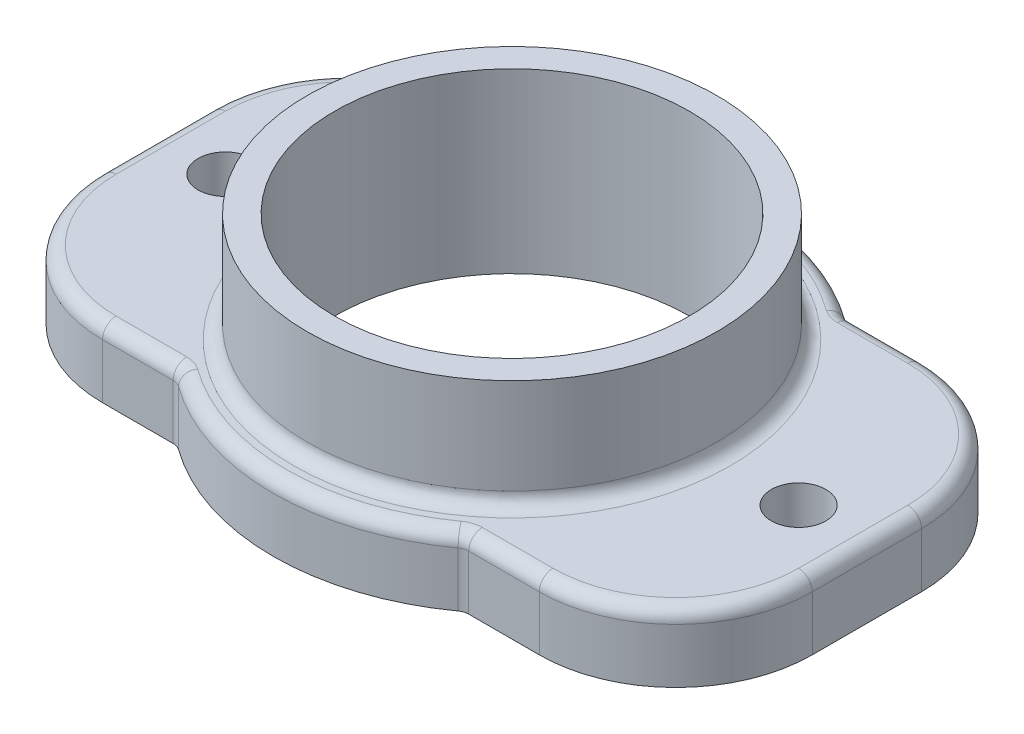
ISO-10303-21;
HEADER;
FILE_DESCRIPTION(('STEP AP214'),'2;1');
FILE_NAME('part.step','',(''),(''),'','','');
FILE_SCHEMA(('AUTOMOTIVE_DESIGN { 1 0 10303 214 1 1 1 1 }'));
ENDSEC;
DATA;
#1=APPLICATION_CONTEXT('core data for automotive mechanical design processes');
#2=APPLICATION_PROTOCOL_DEFINITION('international standard','automotive_design',2000,#1);
#3=PRODUCT_CONTEXT('',#1,'mechanical');
#4=PRODUCT('Part','Part','',(#3));
#5=PRODUCT_RELATED_PRODUCT_CATEGORY('part','',(#4));
#6=PRODUCT_DEFINITION_FORMATION('','',#4);
#7=PRODUCT_DEFINITION_CONTEXT('part definition',#1,'design');
#8=PRODUCT_DEFINITION('design','',#6,#7);
#9=PRODUCT_DEFINITION_SHAPE('','',#8);
#10=(LENGTH_UNIT() NAMED_UNIT(*) SI_UNIT(.MILLI.,.METRE.));
#11=(NAMED_UNIT(*) PLANE_ANGLE_UNIT() SI_UNIT($,.RADIAN.));
#12=(NAMED_UNIT(*) SI_UNIT($,.STERADIAN.) SOLID_ANGLE_UNIT());
#13=UNCERTAINTY_MEASURE_WITH_UNIT(LENGTH_MEASURE(1.E-05),#10,'distance_accuracy_value','');
#14=(GEOMETRIC_REPRESENTATION_CONTEXT(3) GLOBAL_UNCERTAINTY_ASSIGNED_CONTEXT((#13)) GLOBAL_UNIT_ASSIGNED_CONTEXT((#10,
#11,#12)) REPRESENTATION_CONTEXT('',''));
#15=CARTESIAN_POINT('',(0.,0.,0.));
#16=DIRECTION('',(0.,0.,1.));
#17=DIRECTION('',(1.,0.,0.));
#18=AXIS2_PLACEMENT_3D('',#15,#16,#17);
#19=CARTESIAN_POINT('',(0.,5.,0.));
#20=DIRECTION('',(0.,1.,0.));
#21=DIRECTION('',(0.,0.,1.));
#22=AXIS2_PLACEMENT_3D('',#19,#20,#21);
#23=PLANE('',#22);
#24=CARTESIAN_POINT('',(0.,5.,0.));
#25=DIRECTION('',(0.,1.,0.));
#26=DIRECTION('',(0.,0.,1.));
#27=AXIS2_PLACEMENT_3D('',#24,#25,#26);
#28=CIRCLE('',#27,16.5);
#29=CARTESIAN_POINT('',(9.65758727451832,5.,-13.3783783783784));
#30=VERTEX_POINT('',#29);
#31=CARTESIAN_POINT('',(-9.65758727451832,5.,-13.3783783783784));
#32=VERTEX_POINT('',#31);
#33=EDGE_CURVE('E312',#30,#32,#28,.T.);
#34=ORIENTED_EDGE('',*,*,#33,.T.);
#35=CARTESIAN_POINT('',(-10.8282039138539,5.,-15.));
#36=DIRECTION('',(0.,1.,0.));
#37=DIRECTION('',(0.,0.,1.));
#38=AXIS2_PLACEMENT_3D('',#35,#36,#37);
#39=CIRCLE('',#38,2.);
#40=CARTESIAN_POINT('',(-10.8282039138539,5.,-13.));
#41=VERTEX_POINT('',#40);
#42=EDGE_CURVE('E314',#32,#41,#39,.F.);
#43=ORIENTED_EDGE('',*,*,#42,.T.);
#44=DIRECTION('',(-1.,0.,0.));
#45=VECTOR('',#44,1.);
#46=CARTESIAN_POINT('',(-16.,5.,-13.));
#47=LINE('',#46,#45);
#48=CARTESIAN_POINT('',(-16.,5.,-13.));
#49=VERTEX_POINT('',#48);
#50=EDGE_CURVE('E284',#41,#49,#47,.T.);
#51=ORIENTED_EDGE('',*,*,#50,.T.);
#52=CARTESIAN_POINT('',(-16.,5.,-4.));
#53=DIRECTION('',(0.,1.,0.));
#54=DIRECTION('',(0.,0.,1.));
#55=AXIS2_PLACEMENT_3D('',#52,#53,#54);
#56=CIRCLE('',#55,9.);
#57=CARTESIAN_POINT('',(-25.,5.,-4.));
#58=VERTEX_POINT('',#57);
#59=EDGE_CURVE('E286',#49,#58,#56,.T.);
#60=ORIENTED_EDGE('',*,*,#59,.T.);
#61=DIRECTION('',(0.,0.,1.));
#62=VECTOR('',#61,1.);
#63=CARTESIAN_POINT('',(-25.,5.,4.));
#64=LINE('',#63,#62);
#65=CARTESIAN_POINT('',(-25.,5.,4.));
#66=VERTEX_POINT('',#65);
#67=EDGE_CURVE('E288',#58,#66,#64,.T.);
#68=ORIENTED_EDGE('',*,*,#67,.T.);
#69=CARTESIAN_POINT('',(-16.,5.,4.));
#70=DIRECTION('',(0.,1.,0.));
#71=DIRECTION('',(0.,0.,1.));
#72=AXIS2_PLACEMENT_3D('',#69,#70,#71);
#73=CIRCLE('',#72,9.);
#74=CARTESIAN_POINT('',(-16.,5.,13.));
#75=VERTEX_POINT('',#74);
#76=EDGE_CURVE('E290',#66,#75,#73,.T.);
#77=ORIENTED_EDGE('',*,*,#76,.T.);
#78=DIRECTION('',(1.,0.,0.));
#79=VECTOR('',#78,1.);
#80=CARTESIAN_POINT('',(-10.8282039138539,5.,13.));
#81=LINE('',#80,#79);
#82=CARTESIAN_POINT('',(-10.8282039138539,5.,13.));
#83=VERTEX_POINT('',#82);
#84=EDGE_CURVE('E292',#75,#83,#81,.T.);
#85=ORIENTED_EDGE('',*,*,#84,.T.);
#86=CARTESIAN_POINT('',(-10.8282039138539,5.,15.));
#87=DIRECTION('',(0.,1.,0.));
#88=DIRECTION('',(0.,0.,1.));
#89=AXIS2_PLACEMENT_3D('',#86,#87,#88);
#90=CIRCLE('',#89,2.);
#91=CARTESIAN_POINT('',(-9.65758727451831,5.,13.3783783783784));
#92=VERTEX_POINT('',#91);
#93=EDGE_CURVE('E294',#83,#92,#90,.F.);
#94=ORIENTED_EDGE('',*,*,#93,.T.);
#95=CARTESIAN_POINT('',(0.,5.,0.));
#96=DIRECTION('',(0.,1.,0.));
#97=DIRECTION('',(0.,0.,1.));
#98=AXIS2_PLACEMENT_3D('',#95,#96,#97);
#99=CIRCLE('',#98,16.5);
#100=CARTESIAN_POINT('',(9.65758727451832,5.,13.3783783783784));
#101=VERTEX_POINT('',#100);
#102=EDGE_CURVE('E296',#92,#101,#99,.T.);
#103=ORIENTED_EDGE('',*,*,#102,.T.);
#104=CARTESIAN_POINT('',(10.8282039138539,5.,15.));
#105=DIRECTION('',(0.,1.,0.));
#106=DIRECTION('',(0.,0.,1.));
#107=AXIS2_PLACEMENT_3D('',#104,#105,#106);
#108=CIRCLE('',#107,2.);
#109=CARTESIAN_POINT('',(10.8282039138539,5.,13.));
#110=VERTEX_POINT('',#109);
#111=EDGE_CURVE('E298',#101,#110,#108,.F.);
#112=ORIENTED_EDGE('',*,*,#111,.T.);
#113=DIRECTION('',(1.,0.,0.));
#114=VECTOR('',#113,1.);
#115=CARTESIAN_POINT('',(16.,5.,13.));
#116=LINE('',#115,#114);
#117=CARTESIAN_POINT('',(16.,5.,13.));
#118=VERTEX_POINT('',#117);
#119=EDGE_CURVE('E300',#110,#118,#116,.T.);
#120=ORIENTED_EDGE('',*,*,#119,.T.);
#121=CARTESIAN_POINT('',(16.,5.,4.));
#122=DIRECTION('',(0.,1.,0.));
#123=DIRECTION('',(0.,0.,1.));
#124=AXIS2_PLACEMENT_3D('',#121,#122,#123);
#125=CIRCLE('',#124,9.);
#126=CARTESIAN_POINT('',(25.,5.,4.));
#127=VERTEX_POINT('',#126);
#128=EDGE_CURVE('E302',#118,#127,#125,.T.);
#129=ORIENTED_EDGE('',*,*,#128,.T.);
#130=DIRECTION('',(0.,0.,-1.));
#131=VECTOR('',#130,1.);
#132=CARTESIAN_POINT('',(25.,5.,-4.));
#133=LINE('',#132,#131);
#134=CARTESIAN_POINT('',(25.,5.,-4.));
#135=VERTEX_POINT('',#134);
#136=EDGE_CURVE('E304',#127,#135,#133,.T.);
#137=ORIENTED_EDGE('',*,*,#136,.T.);
#138=CARTESIAN_POINT('',(16.,5.,-4.));
#139=DIRECTION('',(0.,1.,0.));
#140=DIRECTION('',(0.,0.,1.));
#141=AXIS2_PLACEMENT_3D('',#138,#139,#140);
#142=CIRCLE('',#141,9.);
#143=CARTESIAN_POINT('',(16.,5.,-13.));
#144=VERTEX_POINT('',#143);
#145=EDGE_CURVE('E306',#135,#144,#142,.T.);
#146=ORIENTED_EDGE('',*,*,#145,.T.);
#147=DIRECTION('',(-1.,0.,0.));
#148=VECTOR('',#147,1.);
#149=CARTESIAN_POINT('',(10.8282039138539,5.,-13.));
#150=LINE('',#149,#148);
#151=CARTESIAN_POINT('',(10.8282039138539,5.,-13.));
#152=VERTEX_POINT('',#151);
#153=EDGE_CURVE('E308',#144,#152,#150,.T.);
#154=ORIENTED_EDGE('',*,*,#153,.T.);
#155=CARTESIAN_POINT('',(10.8282039138539,5.,-15.));
#156=DIRECTION('',(0.,1.,0.));
#157=DIRECTION('',(0.,0.,1.));
#158=AXIS2_PLACEMENT_3D('',#155,#156,#157);
#159=CIRCLE('',#158,2.);
#160=EDGE_CURVE('E310',#152,#30,#159,.F.);
#161=ORIENTED_EDGE('',*,*,#160,.T.);
#162=EDGE_LOOP('',(#34,#43,#51,#60,#68,#77,#85,#94,#103,#112,#120,#129,#137,#146,#154,#161));
#163=FACE_BOUND('',#162,.T.);
#164=CARTESIAN_POINT('',(0.,5.,0.));
#165=DIRECTION('',(0.,1.,0.));
#166=DIRECTION('',(0.,0.,1.));
#167=AXIS2_PLACEMENT_3D('',#164,#165,#166);
#168=CIRCLE('',#167,16.);
#169=CARTESIAN_POINT('',(0.,5.,16.));
#170=VERTEX_POINT('',#169);
#171=EDGE_CURVE('E255',#170,#170,#168,.F.);
#172=ORIENTED_EDGE('',*,*,#171,.T.);
#173=EDGE_LOOP('',(#172));
#174=FACE_BOUND('',#173,.T.);
#175=CARTESIAN_POINT('',(-21.,5.,0.));
#176=DIRECTION('',(0.,1.,0.));
#177=DIRECTION('',(0.,0.,1.));
#178=AXIS2_PLACEMENT_3D('',#175,#176,#177);
#179=CIRCLE('',#178,2.);
#180=CARTESIAN_POINT('',(-21.,5.,2.));
#181=VERTEX_POINT('',#180);
#182=EDGE_CURVE('E407',#181,#181,#179,.T.);
#183=ORIENTED_EDGE('',*,*,#182,.F.);
#184=EDGE_LOOP('',(#183));
#185=FACE_BOUND('',#184,.T.);
#186=CARTESIAN_POINT('',(21.,5.,0.));
#187=DIRECTION('',(0.,1.,0.));
#188=DIRECTION('',(0.,0.,1.));
#189=AXIS2_PLACEMENT_3D('',#186,#187,#188);
#190=CIRCLE('',#189,2.);
#191=CARTESIAN_POINT('',(21.,5.,2.));
#192=VERTEX_POINT('',#191);
#193=EDGE_CURVE('E397',#192,#192,#190,.F.);
#194=ORIENTED_EDGE('',*,*,#193,.T.);
#195=EDGE_LOOP('',(#194));
#196=FACE_BOUND('',#195,.T.);
#197=ADVANCED_FACE('F35',(#163,#174,#185,#196),#23,.T.);
#198=CARTESIAN_POINT('',(0.,0.,0.));
#199=DIRECTION('',(0.,1.,0.));
#200=DIRECTION('',(0.,0.,1.));
#201=AXIS2_PLACEMENT_3D('',#198,#199,#200);
#202=PLANE('',#201);
#203=DIRECTION('',(-1.,0.,0.));
#204=VECTOR('',#203,1.);
#205=CARTESIAN_POINT('',(-26.,0.,-14.));
#206=LINE('',#205,#204);
#207=CARTESIAN_POINT('',(16.,0.,-14.));
#208=VERTEX_POINT('',#207);
#209=CARTESIAN_POINT('',(10.8282039138539,0.,-14.));
#210=VERTEX_POINT('',#209);
#211=EDGE_CURVE('E203',#208,#210,#206,.T.);
#212=ORIENTED_EDGE('',*,*,#211,.F.);
#213=CARTESIAN_POINT('',(16.,0.,-4.));
#214=DIRECTION('',(0.,1.,0.));
#215=DIRECTION('',(0.,0.,1.));
#216=AXIS2_PLACEMENT_3D('',#213,#214,#215);
#217=CIRCLE('',#216,10.);
#218=CARTESIAN_POINT('',(26.,0.,-4.));
#219=VERTEX_POINT('',#218);
#220=EDGE_CURVE('E212',#208,#219,#217,.F.);
#221=ORIENTED_EDGE('',*,*,#220,.T.);
#222=DIRECTION('',(0.,0.,-1.));
#223=VECTOR('',#222,1.);
#224=CARTESIAN_POINT('',(26.,0.,-14.));
#225=LINE('',#224,#223);
#226=CARTESIAN_POINT('',(26.,0.,3.99999999999999));
#227=VERTEX_POINT('',#226);
#228=EDGE_CURVE('E229',#227,#219,#225,.T.);
#229=ORIENTED_EDGE('',*,*,#228,.F.);
#230=CARTESIAN_POINT('',(16.,0.,4.));
#231=DIRECTION('',(0.,1.,0.));
#232=DIRECTION('',(0.,0.,1.));
#233=AXIS2_PLACEMENT_3D('',#230,#231,#232);
#234=CIRCLE('',#233,10.);
#235=CARTESIAN_POINT('',(16.,0.,14.));
#236=VERTEX_POINT('',#235);
#237=EDGE_CURVE('E220',#227,#236,#234,.F.);
#238=ORIENTED_EDGE('',*,*,#237,.T.);
#239=DIRECTION('',(1.,0.,0.));
#240=VECTOR('',#239,1.);
#241=CARTESIAN_POINT('',(-26.,0.,14.));
#242=LINE('',#241,#240);
#243=CARTESIAN_POINT('',(10.8282039138539,0.,14.));
#244=VERTEX_POINT('',#243);
#245=EDGE_CURVE('E425',#244,#236,#242,.T.);
#246=ORIENTED_EDGE('',*,*,#245,.F.);
#247=CARTESIAN_POINT('',(10.8282039138539,0.,15.));
#248=DIRECTION('',(0.,1.,0.));
#249=DIRECTION('',(0.,0.,1.));
#250=AXIS2_PLACEMENT_3D('',#247,#248,#249);
#251=CIRCLE('',#250,1.);
#252=CARTESIAN_POINT('',(10.2428955941861,0.,14.1891891891892));
#253=VERTEX_POINT('',#252);
#254=EDGE_CURVE('E282',#244,#253,#251,.T.);
#255=ORIENTED_EDGE('',*,*,#254,.T.);
#256=CARTESIAN_POINT('',(0.,0.,0.));
#257=DIRECTION('',(0.,1.,0.));
#258=DIRECTION('',(0.,0.,1.));
#259=AXIS2_PLACEMENT_3D('',#256,#257,#258);
#260=CIRCLE('',#259,17.5);
#261=CARTESIAN_POINT('',(-10.2428955941861,0.,14.1891891891892));
#262=VERTEX_POINT('',#261);
#263=EDGE_CURVE('E419',#262,#253,#260,.T.);
#264=ORIENTED_EDGE('',*,*,#263,.F.);
#265=CARTESIAN_POINT('',(-10.8282039138539,0.,15.));
#266=DIRECTION('',(0.,1.,0.));
#267=DIRECTION('',(0.,0.,1.));
#268=AXIS2_PLACEMENT_3D('',#265,#266,#267);
#269=CIRCLE('',#268,1.);
#270=CARTESIAN_POINT('',(-10.8282039138539,0.,14.));
#271=VERTEX_POINT('',#270);
#272=EDGE_CURVE('E280',#262,#271,#269,.T.);
#273=ORIENTED_EDGE('',*,*,#272,.T.);
#274=CARTESIAN_POINT('',(-16.,0.,14.));
#275=VERTEX_POINT('',#274);
#276=EDGE_CURVE('E426',#275,#271,#242,.T.);
#277=ORIENTED_EDGE('',*,*,#276,.F.);
#278=CARTESIAN_POINT('',(-16.,0.,4.));
#279=DIRECTION('',(0.,1.,0.));
#280=DIRECTION('',(0.,0.,1.));
#281=AXIS2_PLACEMENT_3D('',#278,#279,#280);
#282=CIRCLE('',#281,10.);
#283=CARTESIAN_POINT('',(-26.,0.,4.));
#284=VERTEX_POINT('',#283);
#285=EDGE_CURVE('E235',#275,#284,#282,.F.);
#286=ORIENTED_EDGE('',*,*,#285,.T.);
#287=DIRECTION('',(0.,0.,1.));
#288=VECTOR('',#287,1.);
#289=CARTESIAN_POINT('',(-26.,0.,-14.));
#290=LINE('',#289,#288);
#291=CARTESIAN_POINT('',(-26.,0.,-4.));
#292=VERTEX_POINT('',#291);
#293=EDGE_CURVE('E423',#292,#284,#290,.T.);
#294=ORIENTED_EDGE('',*,*,#293,.F.);
#295=CARTESIAN_POINT('',(-16.,0.,-4.));
#296=DIRECTION('',(0.,1.,0.));
#297=DIRECTION('',(0.,0.,1.));
#298=AXIS2_PLACEMENT_3D('',#295,#296,#297);
#299=CIRCLE('',#298,10.);
#300=CARTESIAN_POINT('',(-16.,0.,-14.));
#301=VERTEX_POINT('',#300);
#302=EDGE_CURVE('E209',#292,#301,#299,.F.);
#303=ORIENTED_EDGE('',*,*,#302,.T.);
#304=CARTESIAN_POINT('',(-10.8282039138539,0.,-14.));
#305=VERTEX_POINT('',#304);
#306=EDGE_CURVE('E227',#305,#301,#206,.T.);
#307=ORIENTED_EDGE('',*,*,#306,.F.);
#308=CARTESIAN_POINT('',(-10.8282039138539,0.,-15.));
#309=DIRECTION('',(0.,1.,0.));
#310=DIRECTION('',(0.,0.,1.));
#311=AXIS2_PLACEMENT_3D('',#308,#309,#310);
#312=CIRCLE('',#311,1.);
#313=CARTESIAN_POINT('',(-10.2428955941861,0.,-14.1891891891892));
#314=VERTEX_POINT('',#313);
#315=EDGE_CURVE('E278',#305,#314,#312,.T.);
#316=ORIENTED_EDGE('',*,*,#315,.T.);
#317=CARTESIAN_POINT('',(10.2428955941861,0.,-14.1891891891892));
#318=VERTEX_POINT('',#317);
#319=EDGE_CURVE('E422',#318,#314,#260,.T.);
#320=ORIENTED_EDGE('',*,*,#319,.F.);
#321=CARTESIAN_POINT('',(10.8282039138539,0.,-15.));
#322=DIRECTION('',(0.,1.,0.));
#323=DIRECTION('',(0.,0.,1.));
#324=AXIS2_PLACEMENT_3D('',#321,#322,#323);
#325=CIRCLE('',#324,1.);
#326=EDGE_CURVE('E226',#318,#210,#325,.T.);
#327=ORIENTED_EDGE('',*,*,#326,.T.);
#328=EDGE_LOOP('',(#212,#221,#229,#238,#246,#255,#264,#273,#277,#286,#294,#303,#307,#316,#320,#327));
#329=FACE_BOUND('',#328,.T.);
#330=CARTESIAN_POINT('',(0.,0.,0.));
#331=DIRECTION('',(0.,1.,0.));
#332=DIRECTION('',(0.,0.,1.));
#333=AXIS2_PLACEMENT_3D('',#330,#331,#332);
#334=CIRCLE('',#333,13.);
#335=CARTESIAN_POINT('',(0.,0.,13.));
#336=VERTEX_POINT('',#335);
#337=EDGE_CURVE('E411',#336,#336,#334,.T.);
#338=ORIENTED_EDGE('',*,*,#337,.T.);
#339=EDGE_LOOP('',(#338));
#340=FACE_BOUND('',#339,.T.);
#341=CARTESIAN_POINT('',(-21.,0.,0.));
#342=DIRECTION('',(0.,-1.,0.));
#343=DIRECTION('',(0.,0.,-1.));
#344=AXIS2_PLACEMENT_3D('',#341,#342,#343);
#345=CIRCLE('',#344,2.);
#346=CARTESIAN_POINT('',(-21.,0.,-2.));
#347=VERTEX_POINT('',#346);
#348=EDGE_CURVE('E402',#347,#347,#345,.T.);
#349=ORIENTED_EDGE('',*,*,#348,.F.);
#350=EDGE_LOOP('',(#349));
#351=FACE_BOUND('',#350,.T.);
#352=CARTESIAN_POINT('',(21.,0.,0.));
#353=DIRECTION('',(0.,1.,0.));
#354=DIRECTION('',(0.,0.,-1.));
#355=AXIS2_PLACEMENT_3D('',#352,#353,#354);
#356=CIRCLE('',#355,2.);
#357=CARTESIAN_POINT('',(21.,0.,-2.));
#358=VERTEX_POINT('',#357);
#359=EDGE_CURVE('E391',#358,#358,#356,.T.);
#360=ORIENTED_EDGE('',*,*,#359,.T.);
#361=EDGE_LOOP('',(#360));
#362=FACE_BOUND('',#361,.T.);
#363=ADVANCED_FACE('F222',(#329,#340,#351,#362),#202,.F.);
#364=CARTESIAN_POINT('',(-26.,5.,14.));
#365=DIRECTION('',(0.,0.,-1.));
#366=DIRECTION('',(-1.,0.,0.));
#367=AXIS2_PLACEMENT_3D('',#364,#365,#366);
#368=PLANE('',#367);
#369=DIRECTION('',(0.,-1.,0.));
#370=VECTOR('',#369,1.);
#371=CARTESIAN_POINT('',(16.,5.,14.));
#372=LINE('',#371,#370);
#373=CARTESIAN_POINT('',(16.,4.,14.));
#374=VERTEX_POINT('',#373);
#375=EDGE_CURVE('E241',#236,#374,#372,.F.);
#376=ORIENTED_EDGE('',*,*,#375,.T.);
#377=DIRECTION('',(1.,0.,0.));
#378=VECTOR('',#377,1.);
#379=CARTESIAN_POINT('',(10.8282039138539,4.,14.));
#380=LINE('',#379,#378);
#381=CARTESIAN_POINT('',(10.8282039138539,4.,14.));
#382=VERTEX_POINT('',#381);
#383=EDGE_CURVE('E331',#374,#382,#380,.F.);
#384=ORIENTED_EDGE('',*,*,#383,.T.);
#385=DIRECTION('',(0.,1.,0.));
#386=VECTOR('',#385,1.);
#387=CARTESIAN_POINT('',(10.8282039138539,0.,14.));
#388=LINE('',#387,#386);
#389=EDGE_CURVE('E275',#382,#244,#388,.F.);
#390=ORIENTED_EDGE('',*,*,#389,.T.);
#391=ORIENTED_EDGE('',*,*,#245,.T.);
#392=EDGE_LOOP('',(#376,#384,#390,#391));
#393=FACE_BOUND('',#392,.T.);
#394=ADVANCED_FACE('F433',(#393),#368,.F.);
#395=DIRECTION('',(0.,1.,0.));
#396=VECTOR('',#395,1.);
#397=CARTESIAN_POINT('',(-10.8282039138539,5.,14.));
#398=LINE('',#397,#396);
#399=CARTESIAN_POINT('',(-10.8282039138539,4.,14.));
#400=VERTEX_POINT('',#399);
#401=EDGE_CURVE('E272',#271,#400,#398,.T.);
#402=ORIENTED_EDGE('',*,*,#401,.T.);
#403=DIRECTION('',(1.,0.,0.));
#404=VECTOR('',#403,1.);
#405=CARTESIAN_POINT('',(-16.,4.,14.));
#406=LINE('',#405,#404);
#407=CARTESIAN_POINT('',(-16.,4.,14.));
#408=VERTEX_POINT('',#407);
#409=EDGE_CURVE('E339',#400,#408,#406,.F.);
#410=ORIENTED_EDGE('',*,*,#409,.T.);
#411=DIRECTION('',(0.,-1.,0.));
#412=VECTOR('',#411,1.);
#413=CARTESIAN_POINT('',(-16.,5.,14.));
#414=LINE('',#413,#412);
#415=EDGE_CURVE('E244',#408,#275,#414,.T.);
#416=ORIENTED_EDGE('',*,*,#415,.T.);
#417=ORIENTED_EDGE('',*,*,#276,.T.);
#418=EDGE_LOOP('',(#402,#410,#416,#417));
#419=FACE_BOUND('',#418,.T.);
#420=ADVANCED_FACE('F554',(#419),#368,.F.);
#421=CARTESIAN_POINT('',(-26.,5.,-14.));
#422=DIRECTION('',(0.,0.,1.));
#423=DIRECTION('',(1.,0.,0.));
#424=AXIS2_PLACEMENT_3D('',#421,#422,#423);
#425=PLANE('',#424);
#426=DIRECTION('',(0.,-1.,0.));
#427=VECTOR('',#426,1.);
#428=CARTESIAN_POINT('',(-16.,5.,-14.));
#429=LINE('',#428,#427);
#430=CARTESIAN_POINT('',(-16.,4.,-14.));
#431=VERTEX_POINT('',#430);
#432=EDGE_CURVE('E250',#301,#431,#429,.F.);
#433=ORIENTED_EDGE('',*,*,#432,.T.);
#434=DIRECTION('',(-1.,0.,0.));
#435=VECTOR('',#434,1.);
#436=CARTESIAN_POINT('',(-10.8282039138539,4.,-14.));
#437=LINE('',#436,#435);
#438=CARTESIAN_POINT('',(-10.8282039138539,4.,-14.));
#439=VERTEX_POINT('',#438);
#440=EDGE_CURVE('E11',#431,#439,#437,.F.);
#441=ORIENTED_EDGE('',*,*,#440,.T.);
#442=DIRECTION('',(0.,1.,0.));
#443=VECTOR('',#442,1.);
#444=CARTESIAN_POINT('',(-10.8282039138539,0.,-14.));
#445=LINE('',#444,#443);
#446=EDGE_CURVE('E265',#439,#305,#445,.F.);
#447=ORIENTED_EDGE('',*,*,#446,.T.);
#448=ORIENTED_EDGE('',*,*,#306,.T.);
#449=EDGE_LOOP('',(#433,#441,#447,#448));
#450=FACE_BOUND('',#449,.T.);
#451=ADVANCED_FACE('F502',(#450),#425,.F.);
#452=DIRECTION('',(0.,1.,0.));
#453=VECTOR('',#452,1.);
#454=CARTESIAN_POINT('',(10.8282039138539,5.,-14.));
#455=LINE('',#454,#453);
#456=CARTESIAN_POINT('',(10.8282039138539,4.,-14.));
#457=VERTEX_POINT('',#456);
#458=EDGE_CURVE('E263',#210,#457,#455,.T.);
#459=ORIENTED_EDGE('',*,*,#458,.T.);
#460=DIRECTION('',(-1.,0.,0.));
#461=VECTOR('',#460,1.);
#462=CARTESIAN_POINT('',(16.,4.,-14.));
#463=LINE('',#462,#461);
#464=CARTESIAN_POINT('',(16.,4.,-14.));
#465=VERTEX_POINT('',#464);
#466=EDGE_CURVE('E206',#457,#465,#463,.F.);
#467=ORIENTED_EDGE('',*,*,#466,.T.);
#468=DIRECTION('',(0.,-1.,0.));
#469=VECTOR('',#468,1.);
#470=CARTESIAN_POINT('',(16.,5.,-14.));
#471=LINE('',#470,#469);
#472=EDGE_CURVE('E198',#465,#208,#471,.T.);
#473=ORIENTED_EDGE('',*,*,#472,.T.);
#474=ORIENTED_EDGE('',*,*,#211,.T.);
#475=EDGE_LOOP('',(#459,#467,#473,#474));
#476=FACE_BOUND('',#475,.T.);
#477=ADVANCED_FACE('F201',(#476),#425,.F.);
#478=CARTESIAN_POINT('',(-26.,5.,-14.));
#479=DIRECTION('',(1.,0.,0.));
#480=DIRECTION('',(0.,0.,-1.));
#481=AXIS2_PLACEMENT_3D('',#478,#479,#480);
#482=PLANE('',#481);
#483=DIRECTION('',(0.,-1.,0.));
#484=VECTOR('',#483,1.);
#485=CARTESIAN_POINT('',(-26.,5.,4.));
#486=LINE('',#485,#484);
#487=CARTESIAN_POINT('',(-26.,4.,4.));
#488=VERTEX_POINT('',#487);
#489=EDGE_CURVE('E248',#284,#488,#486,.F.);
#490=ORIENTED_EDGE('',*,*,#489,.T.);
#491=DIRECTION('',(0.,0.,1.));
#492=VECTOR('',#491,1.);
#493=CARTESIAN_POINT('',(-26.,4.,-4.));
#494=LINE('',#493,#492);
#495=CARTESIAN_POINT('',(-26.,4.,-4.));
#496=VERTEX_POINT('',#495);
#497=EDGE_CURVE('E59',#488,#496,#494,.F.);
#498=ORIENTED_EDGE('',*,*,#497,.T.);
#499=DIRECTION('',(0.,-1.,0.));
#500=VECTOR('',#499,1.);
#501=CARTESIAN_POINT('',(-26.,5.,-4.));
#502=LINE('',#501,#500);
#503=EDGE_CURVE('E246',#496,#292,#502,.T.);
#504=ORIENTED_EDGE('',*,*,#503,.T.);
#505=ORIENTED_EDGE('',*,*,#293,.T.);
#506=EDGE_LOOP('',(#490,#498,#504,#505));
#507=FACE_BOUND('',#506,.T.);
#508=ADVANCED_FACE('F478',(#507),#482,.F.);
#509=CARTESIAN_POINT('',(26.,5.,-14.));
#510=DIRECTION('',(-1.,0.,0.));
#511=DIRECTION('',(0.,0.,1.));
#512=AXIS2_PLACEMENT_3D('',#509,#510,#511);
#513=PLANE('',#512);
#514=DIRECTION('',(0.,-1.,0.));
#515=VECTOR('',#514,1.);
#516=CARTESIAN_POINT('',(26.,5.,-4.));
#517=LINE('',#516,#515);
#518=CARTESIAN_POINT('',(26.,4.,-4.));
#519=VERTEX_POINT('',#518);
#520=EDGE_CURVE('E215',#219,#519,#517,.F.);
#521=ORIENTED_EDGE('',*,*,#520,.T.);
#522=DIRECTION('',(0.,0.,-1.));
#523=VECTOR('',#522,1.);
#524=CARTESIAN_POINT('',(26.,4.,3.99999999999999));
#525=LINE('',#524,#523);
#526=CARTESIAN_POINT('',(26.,4.,4.));
#527=VERTEX_POINT('',#526);
#528=EDGE_CURVE('E327',#519,#527,#525,.F.);
#529=ORIENTED_EDGE('',*,*,#528,.T.);
#530=DIRECTION('',(0.,-1.,0.));
#531=VECTOR('',#530,1.);
#532=CARTESIAN_POINT('',(26.,5.,4.));
#533=LINE('',#532,#531);
#534=EDGE_CURVE('E219',#527,#227,#533,.T.);
#535=ORIENTED_EDGE('',*,*,#534,.T.);
#536=ORIENTED_EDGE('',*,*,#228,.T.);
#537=EDGE_LOOP('',(#521,#529,#535,#536));
#538=FACE_BOUND('',#537,.T.);
#539=ADVANCED_FACE('F535',(#538),#513,.F.);
#540=CARTESIAN_POINT('',(0.,5.,0.));
#541=DIRECTION('',(0.,-1.,0.));
#542=DIRECTION('',(0.,0.,-1.));
#543=AXIS2_PLACEMENT_3D('',#540,#541,#542);
#544=CYLINDRICAL_SURFACE('',#543,17.5);
#545=DIRECTION('',(0.,-1.,0.));
#546=VECTOR('',#545,1.);
#547=CARTESIAN_POINT('',(-10.2428955941861,5.,-14.1891891891892));
#548=LINE('',#547,#546);
#549=CARTESIAN_POINT('',(-10.2428955941861,4.,-14.1891891891892));
#550=VERTEX_POINT('',#549);
#551=EDGE_CURVE('E258',#314,#550,#548,.F.);
#552=ORIENTED_EDGE('',*,*,#551,.T.);
#553=CARTESIAN_POINT('',(0.,4.,0.));
#554=DIRECTION('',(0.,1.,0.));
#555=DIRECTION('',(0.,0.,1.));
#556=AXIS2_PLACEMENT_3D('',#553,#554,#555);
#557=CIRCLE('',#556,17.5);
#558=CARTESIAN_POINT('',(10.2428955941861,4.,-14.1891891891892));
#559=VERTEX_POINT('',#558);
#560=EDGE_CURVE('E320',#550,#559,#557,.F.);
#561=ORIENTED_EDGE('',*,*,#560,.T.);
#562=DIRECTION('',(0.,-1.,0.));
#563=VECTOR('',#562,1.);
#564=CARTESIAN_POINT('',(10.2428955941861,5.,-14.1891891891892));
#565=LINE('',#564,#563);
#566=EDGE_CURVE('E261',#559,#318,#565,.T.);
#567=ORIENTED_EDGE('',*,*,#566,.T.);
#568=ORIENTED_EDGE('',*,*,#319,.T.);
#569=EDGE_LOOP('',(#552,#561,#567,#568));
#570=FACE_BOUND('',#569,.T.);
#571=ADVANCED_FACE('F520',(#570),#544,.T.);
#572=DIRECTION('',(0.,-1.,0.));
#573=VECTOR('',#572,1.);
#574=CARTESIAN_POINT('',(10.2428955941861,5.,14.1891891891892));
#575=LINE('',#574,#573);
#576=CARTESIAN_POINT('',(10.2428955941861,4.,14.1891891891892));
#577=VERTEX_POINT('',#576);
#578=EDGE_CURVE('E267',#253,#577,#575,.F.);
#579=ORIENTED_EDGE('',*,*,#578,.T.);
#580=CARTESIAN_POINT('',(0.,4.,0.));
#581=DIRECTION('',(0.,1.,0.));
#582=DIRECTION('',(0.,0.,1.));
#583=AXIS2_PLACEMENT_3D('',#580,#581,#582);
#584=CIRCLE('',#583,17.5);
#585=CARTESIAN_POINT('',(-10.2428955941861,4.,14.1891891891892));
#586=VERTEX_POINT('',#585);
#587=EDGE_CURVE('E335',#577,#586,#584,.F.);
#588=ORIENTED_EDGE('',*,*,#587,.T.);
#589=DIRECTION('',(0.,-1.,0.));
#590=VECTOR('',#589,1.);
#591=CARTESIAN_POINT('',(-10.2428955941861,5.,14.1891891891892));
#592=LINE('',#591,#590);
#593=EDGE_CURVE('E270',#586,#262,#592,.T.);
#594=ORIENTED_EDGE('',*,*,#593,.T.);
#595=ORIENTED_EDGE('',*,*,#263,.T.);
#596=EDGE_LOOP('',(#579,#588,#594,#595));
#597=FACE_BOUND('',#596,.T.);
#598=ADVANCED_FACE('F468',(#597),#544,.T.);
#599=CARTESIAN_POINT('',(0.,13.,0.));
#600=DIRECTION('',(0.,-1.,0.));
#601=DIRECTION('',(0.,0.,-1.));
#602=AXIS2_PLACEMENT_3D('',#599,#600,#601);
#603=CYLINDRICAL_SURFACE('',#602,15.);
#604=CARTESIAN_POINT('',(0.,6.,0.));
#605=DIRECTION('',(0.,1.,0.));
#606=DIRECTION('',(0.,0.,1.));
#607=AXIS2_PLACEMENT_3D('',#604,#605,#606);
#608=CIRCLE('',#607,15.);
#609=CARTESIAN_POINT('',(0.,6.,15.));
#610=VERTEX_POINT('',#609);
#611=EDGE_CURVE('E252',#610,#610,#608,.T.);
#612=ORIENTED_EDGE('',*,*,#611,.T.);
#613=EDGE_LOOP('',(#612));
#614=FACE_BOUND('',#613,.T.);
#615=CARTESIAN_POINT('',(0.,13.,0.));
#616=DIRECTION('',(0.,1.,0.));
#617=DIRECTION('',(0.,0.,1.));
#618=AXIS2_PLACEMENT_3D('',#615,#616,#617);
#619=CIRCLE('',#618,15.);
#620=CARTESIAN_POINT('',(0.,13.,15.));
#621=VERTEX_POINT('',#620);
#622=EDGE_CURVE('E414',#621,#621,#619,.T.);
#623=ORIENTED_EDGE('',*,*,#622,.F.);
#624=EDGE_LOOP('',(#623));
#625=FACE_BOUND('',#624,.T.);
#626=ADVANCED_FACE('F691',(#614,#625),#603,.T.);
#627=CARTESIAN_POINT('',(0.,13.,0.));
#628=DIRECTION('',(0.,1.,0.));
#629=DIRECTION('',(0.,0.,1.));
#630=AXIS2_PLACEMENT_3D('',#627,#628,#629);
#631=PLANE('',#630);
#632=CARTESIAN_POINT('',(0.,13.,0.));
#633=DIRECTION('',(0.,1.,0.));
#634=DIRECTION('',(0.,0.,1.));
#635=AXIS2_PLACEMENT_3D('',#632,#633,#634);
#636=CIRCLE('',#635,13.);
#637=CARTESIAN_POINT('',(0.,13.,13.));
#638=VERTEX_POINT('',#637);
#639=EDGE_CURVE('E410',#638,#638,#636,.T.);
#640=ORIENTED_EDGE('',*,*,#639,.F.);
#641=EDGE_LOOP('',(#640));
#642=FACE_BOUND('',#641,.T.);
#643=ORIENTED_EDGE('',*,*,#622,.T.);
#644=EDGE_LOOP('',(#643));
#645=FACE_BOUND('',#644,.T.);
#646=ADVANCED_FACE('F683',(#642,#645),#631,.T.);
#647=CARTESIAN_POINT('',(0.,0.,0.));
#648=DIRECTION('',(0.,1.,0.));
#649=DIRECTION('',(0.,0.,1.));
#650=AXIS2_PLACEMENT_3D('',#647,#648,#649);
#651=CYLINDRICAL_SURFACE('',#650,13.);
#652=ORIENTED_EDGE('',*,*,#337,.F.);
#653=EDGE_LOOP('',(#652));
#654=FACE_BOUND('',#653,.T.);
#655=ORIENTED_EDGE('',*,*,#639,.T.);
#656=EDGE_LOOP('',(#655));
#657=FACE_BOUND('',#656,.T.);
#658=ADVANCED_FACE('F565',(#654,#657),#651,.F.);
#659=CARTESIAN_POINT('',(16.,5.,-4.));
#660=DIRECTION('',(0.,-1.,0.));
#661=DIRECTION('',(0.,0.,-1.));
#662=AXIS2_PLACEMENT_3D('',#659,#660,#661);
#663=CYLINDRICAL_SURFACE('',#662,10.);
#664=ORIENTED_EDGE('',*,*,#472,.F.);
#665=CARTESIAN_POINT('',(16.,4.,-4.));
#666=DIRECTION('',(0.,1.,0.));
#667=DIRECTION('',(0.,0.,1.));
#668=AXIS2_PLACEMENT_3D('',#665,#666,#667);
#669=CIRCLE('',#668,10.);
#670=EDGE_CURVE('E325',#465,#519,#669,.F.);
#671=ORIENTED_EDGE('',*,*,#670,.T.);
#672=ORIENTED_EDGE('',*,*,#520,.F.);
#673=ORIENTED_EDGE('',*,*,#220,.F.);
#674=EDGE_LOOP('',(#664,#671,#672,#673));
#675=FACE_BOUND('',#674,.T.);
#676=ADVANCED_FACE('F213',(#675),#663,.T.);
#677=CARTESIAN_POINT('',(16.,5.,4.));
#678=DIRECTION('',(0.,-1.,0.));
#679=DIRECTION('',(0.,0.,-1.));
#680=AXIS2_PLACEMENT_3D('',#677,#678,#679);
#681=CYLINDRICAL_SURFACE('',#680,10.);
#682=ORIENTED_EDGE('',*,*,#534,.F.);
#683=CARTESIAN_POINT('',(16.,4.,4.));
#684=DIRECTION('',(0.,1.,0.));
#685=DIRECTION('',(0.,0.,1.));
#686=AXIS2_PLACEMENT_3D('',#683,#684,#685);
#687=CIRCLE('',#686,10.);
#688=EDGE_CURVE('E329',#527,#374,#687,.F.);
#689=ORIENTED_EDGE('',*,*,#688,.T.);
#690=ORIENTED_EDGE('',*,*,#375,.F.);
#691=ORIENTED_EDGE('',*,*,#237,.F.);
#692=EDGE_LOOP('',(#682,#689,#690,#691));
#693=FACE_BOUND('',#692,.T.);
#694=ADVANCED_FACE('F440',(#693),#681,.T.);
#695=CARTESIAN_POINT('',(-16.,5.,4.));
#696=DIRECTION('',(0.,-1.,0.));
#697=DIRECTION('',(0.,0.,-1.));
#698=AXIS2_PLACEMENT_3D('',#695,#696,#697);
#699=CYLINDRICAL_SURFACE('',#698,10.);
#700=ORIENTED_EDGE('',*,*,#415,.F.);
#701=CARTESIAN_POINT('',(-16.,4.,4.));
#702=DIRECTION('',(0.,1.,0.));
#703=DIRECTION('',(0.,0.,1.));
#704=AXIS2_PLACEMENT_3D('',#701,#702,#703);
#705=CIRCLE('',#704,10.);
#706=EDGE_CURVE('E341',#408,#488,#705,.F.);
#707=ORIENTED_EDGE('',*,*,#706,.T.);
#708=ORIENTED_EDGE('',*,*,#489,.F.);
#709=ORIENTED_EDGE('',*,*,#285,.F.);
#710=EDGE_LOOP('',(#700,#707,#708,#709));
#711=FACE_BOUND('',#710,.T.);
#712=ADVANCED_FACE('F481',(#711),#699,.T.);
#713=CARTESIAN_POINT('',(-16.,5.,-4.));
#714=DIRECTION('',(0.,-1.,0.));
#715=DIRECTION('',(0.,0.,-1.));
#716=AXIS2_PLACEMENT_3D('',#713,#714,#715);
#717=CYLINDRICAL_SURFACE('',#716,10.);
#718=ORIENTED_EDGE('',*,*,#503,.F.);
#719=CARTESIAN_POINT('',(-16.,4.,-4.));
#720=DIRECTION('',(0.,1.,0.));
#721=DIRECTION('',(0.,0.,1.));
#722=AXIS2_PLACEMENT_3D('',#719,#720,#721);
#723=CIRCLE('',#722,10.);
#724=EDGE_CURVE('E44',#496,#431,#723,.F.);
#725=ORIENTED_EDGE('',*,*,#724,.T.);
#726=ORIENTED_EDGE('',*,*,#432,.F.);
#727=ORIENTED_EDGE('',*,*,#302,.F.);
#728=EDGE_LOOP('',(#718,#725,#726,#727));
#729=FACE_BOUND('',#728,.T.);
#730=ADVANCED_FACE('F570',(#729),#717,.T.);
#731=CARTESIAN_POINT('',(-21.,13.,0.));
#732=DIRECTION('',(0.,-1.,0.));
#733=DIRECTION('',(0.,0.,-1.));
#734=AXIS2_PLACEMENT_3D('',#731,#732,#733);
#735=CYLINDRICAL_SURFACE('',#734,2.);
#736=ORIENTED_EDGE('',*,*,#182,.T.);
#737=EDGE_LOOP('',(#736));
#738=FACE_BOUND('',#737,.T.);
#739=ORIENTED_EDGE('',*,*,#348,.T.);
#740=EDGE_LOOP('',(#739));
#741=FACE_BOUND('',#740,.T.);
#742=ADVANCED_FACE('F573',(#738,#741),#735,.F.);
#743=CARTESIAN_POINT('',(21.,13.,0.));
#744=DIRECTION('',(0.,-1.,0.));
#745=DIRECTION('',(0.,0.,-1.));
#746=AXIS2_PLACEMENT_3D('',#743,#744,#745);
#747=CYLINDRICAL_SURFACE('',#746,2.);
#748=ORIENTED_EDGE('',*,*,#193,.F.);
#749=EDGE_LOOP('',(#748));
#750=FACE_BOUND('',#749,.T.);
#751=ORIENTED_EDGE('',*,*,#359,.F.);
#752=EDGE_LOOP('',(#751));
#753=FACE_BOUND('',#752,.T.);
#754=ADVANCED_FACE('F577',(#750,#753),#747,.F.);
#755=CARTESIAN_POINT('',(0.,6.,0.));
#756=DIRECTION('',(0.,1.,0.));
#757=DIRECTION('',(0.,0.,1.));
#758=AXIS2_PLACEMENT_3D('',#755,#756,#757);
#759=TOROIDAL_SURFACE('',#758,16.,1.);
#760=ORIENTED_EDGE('',*,*,#171,.F.);
#761=EDGE_LOOP('',(#760));
#762=FACE_BOUND('',#761,.T.);
#763=ORIENTED_EDGE('',*,*,#611,.F.);
#764=EDGE_LOOP('',(#763));
#765=FACE_BOUND('',#764,.T.);
#766=ADVANCED_FACE('F574',(#762,#765),#759,.F.);
#767=CARTESIAN_POINT('',(10.8282039138539,5.,-15.));
#768=DIRECTION('',(0.,-1.,0.));
#769=DIRECTION('',(0.,0.,-1.));
#770=AXIS2_PLACEMENT_3D('',#767,#768,#769);
#771=CYLINDRICAL_SURFACE('',#770,1.);
#772=ORIENTED_EDGE('',*,*,#566,.F.);
#773=CARTESIAN_POINT('',(10.8282039138539,4.,-15.));
#774=DIRECTION('',(0.,1.,0.));
#775=DIRECTION('',(0.,0.,1.));
#776=AXIS2_PLACEMENT_3D('',#773,#774,#775);
#777=CIRCLE('',#776,1.);
#778=EDGE_CURVE('E322',#559,#457,#777,.T.);
#779=ORIENTED_EDGE('',*,*,#778,.T.);
#780=ORIENTED_EDGE('',*,*,#458,.F.);
#781=ORIENTED_EDGE('',*,*,#326,.F.);
#782=EDGE_LOOP('',(#772,#779,#780,#781));
#783=FACE_BOUND('',#782,.T.);
#784=ADVANCED_FACE('F524',(#783),#771,.F.);
#785=CARTESIAN_POINT('',(-10.8282039138539,5.,-15.));
#786=DIRECTION('',(0.,-1.,0.));
#787=DIRECTION('',(0.,0.,-1.));
#788=AXIS2_PLACEMENT_3D('',#785,#786,#787);
#789=CYLINDRICAL_SURFACE('',#788,1.);
#790=ORIENTED_EDGE('',*,*,#446,.F.);
#791=CARTESIAN_POINT('',(-10.8282039138539,4.,-15.));
#792=DIRECTION('',(0.,1.,0.));
#793=DIRECTION('',(0.,0.,1.));
#794=AXIS2_PLACEMENT_3D('',#791,#792,#793);
#795=CIRCLE('',#794,1.);
#796=EDGE_CURVE('E317',#439,#550,#795,.T.);
#797=ORIENTED_EDGE('',*,*,#796,.T.);
#798=ORIENTED_EDGE('',*,*,#551,.F.);
#799=ORIENTED_EDGE('',*,*,#315,.F.);
#800=EDGE_LOOP('',(#790,#797,#798,#799));
#801=FACE_BOUND('',#800,.T.);
#802=ADVANCED_FACE('F507',(#801),#789,.F.);
#803=CARTESIAN_POINT('',(-10.8282039138539,5.,15.));
#804=DIRECTION('',(0.,-1.,0.));
#805=DIRECTION('',(0.,0.,-1.));
#806=AXIS2_PLACEMENT_3D('',#803,#804,#805);
#807=CYLINDRICAL_SURFACE('',#806,1.);
#808=ORIENTED_EDGE('',*,*,#593,.F.);
#809=CARTESIAN_POINT('',(-10.8282039138539,4.,15.));
#810=DIRECTION('',(0.,1.,0.));
#811=DIRECTION('',(0.,0.,1.));
#812=AXIS2_PLACEMENT_3D('',#809,#810,#811);
#813=CIRCLE('',#812,1.);
#814=EDGE_CURVE('E337',#586,#400,#813,.T.);
#815=ORIENTED_EDGE('',*,*,#814,.T.);
#816=ORIENTED_EDGE('',*,*,#401,.F.);
#817=ORIENTED_EDGE('',*,*,#272,.F.);
#818=EDGE_LOOP('',(#808,#815,#816,#817));
#819=FACE_BOUND('',#818,.T.);
#820=ADVANCED_FACE('F471',(#819),#807,.F.);
#821=CARTESIAN_POINT('',(10.8282039138539,5.,15.));
#822=DIRECTION('',(0.,-1.,0.));
#823=DIRECTION('',(0.,0.,-1.));
#824=AXIS2_PLACEMENT_3D('',#821,#822,#823);
#825=CYLINDRICAL_SURFACE('',#824,1.);
#826=ORIENTED_EDGE('',*,*,#389,.F.);
#827=CARTESIAN_POINT('',(10.8282039138539,4.,15.));
#828=DIRECTION('',(0.,1.,0.));
#829=DIRECTION('',(0.,0.,1.));
#830=AXIS2_PLACEMENT_3D('',#827,#828,#829);
#831=CIRCLE('',#830,1.);
#832=EDGE_CURVE('E333',#382,#577,#831,.T.);
#833=ORIENTED_EDGE('',*,*,#832,.T.);
#834=ORIENTED_EDGE('',*,*,#578,.F.);
#835=ORIENTED_EDGE('',*,*,#254,.F.);
#836=EDGE_LOOP('',(#826,#833,#834,#835));
#837=FACE_BOUND('',#836,.T.);
#838=ADVANCED_FACE('F460',(#837),#825,.F.);
#839=CARTESIAN_POINT('',(10.8282039138539,4.,15.));
#840=DIRECTION('',(0.,1.,0.));
#841=DIRECTION('',(0.,0.,1.));
#842=AXIS2_PLACEMENT_3D('',#839,#840,#841);
#843=TOROIDAL_SURFACE('',#842,2.,1.);
#844=CARTESIAN_POINT('',(9.65758727451832,4.,13.3783783783784));
#845=DIRECTION('',(-0.810810810810812,0.,0.585308319667775));
#846=DIRECTION('',(0.585308319667775,0.,0.810810810810812));
#847=AXIS2_PLACEMENT_3D('',#844,#845,#846);
#848=CIRCLE('',#847,1.);
#849=EDGE_CURVE('E384',#577,#101,#848,.T.);
#850=ORIENTED_EDGE('',*,*,#849,.F.);
#851=ORIENTED_EDGE('',*,*,#832,.F.);
#852=CARTESIAN_POINT('',(10.8282039138539,4.,13.));
#853=DIRECTION('',(1.,0.,0.));
#854=DIRECTION('',(0.,0.,-1.));
#855=AXIS2_PLACEMENT_3D('',#852,#853,#854);
#856=CIRCLE('',#855,1.);
#857=EDGE_CURVE('E39',#110,#382,#856,.T.);
#858=ORIENTED_EDGE('',*,*,#857,.F.);
#859=ORIENTED_EDGE('',*,*,#111,.F.);
#860=EDGE_LOOP('',(#850,#851,#858,#859));
#861=FACE_BOUND('',#860,.T.);
#862=ADVANCED_FACE('F37',(#861),#843,.T.);
#863=CARTESIAN_POINT('',(0.,4.,13.));
#864=DIRECTION('',(-1.,0.,0.));
#865=DIRECTION('',(0.,0.,1.));
#866=AXIS2_PLACEMENT_3D('',#863,#864,#865);
#867=CYLINDRICAL_SURFACE('',#866,1.);
#868=ORIENTED_EDGE('',*,*,#857,.T.);
#869=ORIENTED_EDGE('',*,*,#383,.F.);
#870=CARTESIAN_POINT('',(16.,4.,13.));
#871=DIRECTION('',(1.,0.,0.));
#872=DIRECTION('',(0.,0.,-1.));
#873=AXIS2_PLACEMENT_3D('',#870,#871,#872);
#874=CIRCLE('',#873,1.);
#875=EDGE_CURVE('E382',#118,#374,#874,.T.);
#876=ORIENTED_EDGE('',*,*,#875,.F.);
#877=ORIENTED_EDGE('',*,*,#119,.F.);
#878=EDGE_LOOP('',(#868,#869,#876,#877));
#879=FACE_BOUND('',#878,.T.);
#880=ADVANCED_FACE('F457',(#879),#867,.T.);
#881=CARTESIAN_POINT('',(0.,4.,0.));
#882=DIRECTION('',(0.,1.,0.));
#883=DIRECTION('',(0.,0.,1.));
#884=AXIS2_PLACEMENT_3D('',#881,#882,#883);
#885=TOROIDAL_SURFACE('',#884,16.5,1.);
#886=ORIENTED_EDGE('',*,*,#849,.T.);
#887=ORIENTED_EDGE('',*,*,#102,.F.);
#888=CARTESIAN_POINT('',(-9.65758727451831,4.,13.3783783783784));
#889=DIRECTION('',(-0.810810810810811,0.,-0.585308319667776));
#890=DIRECTION('',(-0.585308319667776,0.,0.810810810810811));
#891=AXIS2_PLACEMENT_3D('',#888,#889,#890);
#892=CIRCLE('',#891,1.);
#893=EDGE_CURVE('E379',#586,#92,#892,.T.);
#894=ORIENTED_EDGE('',*,*,#893,.F.);
#895=ORIENTED_EDGE('',*,*,#587,.F.);
#896=EDGE_LOOP('',(#886,#887,#894,#895));
#897=FACE_BOUND('',#896,.T.);
#898=ADVANCED_FACE('F464',(#897),#885,.T.);
#899=CARTESIAN_POINT('',(16.,4.,4.));
#900=DIRECTION('',(0.,1.,0.));
#901=DIRECTION('',(0.,0.,1.));
#902=AXIS2_PLACEMENT_3D('',#899,#900,#901);
#903=TOROIDAL_SURFACE('',#902,9.,1.);
#904=ORIENTED_EDGE('',*,*,#875,.T.);
#905=ORIENTED_EDGE('',*,*,#688,.F.);
#906=CARTESIAN_POINT('',(25.,4.,4.));
#907=DIRECTION('',(0.,0.,-1.));
#908=DIRECTION('',(-1.,0.,0.));
#909=AXIS2_PLACEMENT_3D('',#906,#907,#908);
#910=CIRCLE('',#909,1.);
#911=EDGE_CURVE('E376',#127,#527,#910,.T.);
#912=ORIENTED_EDGE('',*,*,#911,.F.);
#913=ORIENTED_EDGE('',*,*,#128,.F.);
#914=EDGE_LOOP('',(#904,#905,#912,#913));
#915=FACE_BOUND('',#914,.T.);
#916=ADVANCED_FACE('F444',(#915),#903,.T.);
#917=CARTESIAN_POINT('',(-10.8282039138539,4.,15.));
#918=DIRECTION('',(0.,1.,0.));
#919=DIRECTION('',(0.,0.,1.));
#920=AXIS2_PLACEMENT_3D('',#917,#918,#919);
#921=TOROIDAL_SURFACE('',#920,2.,1.);
#922=ORIENTED_EDGE('',*,*,#893,.T.);
#923=ORIENTED_EDGE('',*,*,#93,.F.);
#924=CARTESIAN_POINT('',(-10.8282039138539,4.,13.));
#925=DIRECTION('',(-1.,0.,0.));
#926=DIRECTION('',(0.,0.,1.));
#927=AXIS2_PLACEMENT_3D('',#924,#925,#926);
#928=CIRCLE('',#927,1.);
#929=EDGE_CURVE('E373',#400,#83,#928,.T.);
#930=ORIENTED_EDGE('',*,*,#929,.F.);
#931=ORIENTED_EDGE('',*,*,#814,.F.);
#932=EDGE_LOOP('',(#922,#923,#930,#931));
#933=FACE_BOUND('',#932,.T.);
#934=ADVANCED_FACE('F611',(#933),#921,.T.);
#935=CARTESIAN_POINT('',(25.,4.,0.));
#936=DIRECTION('',(0.,0.,1.));
#937=DIRECTION('',(1.,0.,0.));
#938=AXIS2_PLACEMENT_3D('',#935,#936,#937);
#939=CYLINDRICAL_SURFACE('',#938,1.);
#940=ORIENTED_EDGE('',*,*,#911,.T.);
#941=ORIENTED_EDGE('',*,*,#528,.F.);
#942=CARTESIAN_POINT('',(25.,4.,-4.));
#943=DIRECTION('',(0.,0.,-1.));
#944=DIRECTION('',(-1.,0.,0.));
#945=AXIS2_PLACEMENT_3D('',#942,#943,#944);
#946=CIRCLE('',#945,1.);
#947=EDGE_CURVE('E370',#135,#519,#946,.T.);
#948=ORIENTED_EDGE('',*,*,#947,.F.);
#949=ORIENTED_EDGE('',*,*,#136,.F.);
#950=EDGE_LOOP('',(#940,#941,#948,#949));
#951=FACE_BOUND('',#950,.T.);
#952=ADVANCED_FACE('F450',(#951),#939,.T.);
#953=CARTESIAN_POINT('',(0.,4.,13.));
#954=DIRECTION('',(-1.,0.,0.));
#955=DIRECTION('',(0.,0.,1.));
#956=AXIS2_PLACEMENT_3D('',#953,#954,#955);
#957=CYLINDRICAL_SURFACE('',#956,1.);
#958=ORIENTED_EDGE('',*,*,#929,.T.);
#959=ORIENTED_EDGE('',*,*,#84,.F.);
#960=CARTESIAN_POINT('',(-16.,4.,13.));
#961=DIRECTION('',(-1.,0.,0.));
#962=DIRECTION('',(0.,0.,1.));
#963=AXIS2_PLACEMENT_3D('',#960,#961,#962);
#964=CIRCLE('',#963,1.);
#965=EDGE_CURVE('E367',#408,#75,#964,.T.);
#966=ORIENTED_EDGE('',*,*,#965,.F.);
#967=ORIENTED_EDGE('',*,*,#409,.F.);
#968=EDGE_LOOP('',(#958,#959,#966,#967));
#969=FACE_BOUND('',#968,.T.);
#970=ADVANCED_FACE('F605',(#969),#957,.T.);
#971=CARTESIAN_POINT('',(16.,4.,-4.));
#972=DIRECTION('',(0.,1.,0.));
#973=DIRECTION('',(0.,0.,1.));
#974=AXIS2_PLACEMENT_3D('',#971,#972,#973);
#975=TOROIDAL_SURFACE('',#974,9.,1.);
#976=ORIENTED_EDGE('',*,*,#947,.T.);
#977=ORIENTED_EDGE('',*,*,#670,.F.);
#978=CARTESIAN_POINT('',(16.,4.,-13.));
#979=DIRECTION('',(-1.,0.,0.));
#980=DIRECTION('',(0.,0.,1.));
#981=AXIS2_PLACEMENT_3D('',#978,#979,#980);
#982=CIRCLE('',#981,1.);
#983=EDGE_CURVE('E364',#144,#465,#982,.T.);
#984=ORIENTED_EDGE('',*,*,#983,.F.);
#985=ORIENTED_EDGE('',*,*,#145,.F.);
#986=EDGE_LOOP('',(#976,#977,#984,#985));
#987=FACE_BOUND('',#986,.T.);
#988=ADVANCED_FACE('F533',(#987),#975,.T.);
#989=CARTESIAN_POINT('',(-16.,4.,4.));
#990=DIRECTION('',(0.,1.,0.));
#991=DIRECTION('',(0.,0.,1.));
#992=AXIS2_PLACEMENT_3D('',#989,#990,#991);
#993=TOROIDAL_SURFACE('',#992,9.,1.);
#994=ORIENTED_EDGE('',*,*,#965,.T.);
#995=ORIENTED_EDGE('',*,*,#76,.F.);
#996=CARTESIAN_POINT('',(-25.,4.,4.));
#997=DIRECTION('',(0.,0.,-1.));
#998=DIRECTION('',(-1.,0.,0.));
#999=AXIS2_PLACEMENT_3D('',#996,#997,#998);
#1000=CIRCLE('',#999,1.);
#1001=EDGE_CURVE('E361',#488,#66,#1000,.T.);
#1002=ORIENTED_EDGE('',*,*,#1001,.F.);
#1003=ORIENTED_EDGE('',*,*,#706,.F.);
#1004=EDGE_LOOP('',(#994,#995,#1002,#1003));
#1005=FACE_BOUND('',#1004,.T.);
#1006=ADVANCED_FACE('F485',(#1005),#993,.T.);
#1007=CARTESIAN_POINT('',(0.,4.,-13.));
#1008=DIRECTION('',(1.,0.,0.));
#1009=DIRECTION('',(0.,0.,-1.));
#1010=AXIS2_PLACEMENT_3D('',#1007,#1008,#1009);
#1011=CYLINDRICAL_SURFACE('',#1010,1.);
#1012=ORIENTED_EDGE('',*,*,#983,.T.);
#1013=ORIENTED_EDGE('',*,*,#466,.F.);
#1014=CARTESIAN_POINT('',(10.8282039138539,4.,-13.));
#1015=DIRECTION('',(-1.,0.,0.));
#1016=DIRECTION('',(0.,0.,1.));
#1017=AXIS2_PLACEMENT_3D('',#1014,#1015,#1016);
#1018=CIRCLE('',#1017,1.);
#1019=EDGE_CURVE('E358',#152,#457,#1018,.T.);
#1020=ORIENTED_EDGE('',*,*,#1019,.F.);
#1021=ORIENTED_EDGE('',*,*,#153,.F.);
#1022=EDGE_LOOP('',(#1012,#1013,#1020,#1021));
#1023=FACE_BOUND('',#1022,.T.);
#1024=ADVANCED_FACE('F531',(#1023),#1011,.T.);
#1025=CARTESIAN_POINT('',(-25.,4.,0.));
#1026=DIRECTION('',(0.,0.,-1.));
#1027=DIRECTION('',(-1.,0.,0.));
#1028=AXIS2_PLACEMENT_3D('',#1025,#1026,#1027);
#1029=CYLINDRICAL_SURFACE('',#1028,1.);
#1030=ORIENTED_EDGE('',*,*,#1001,.T.);
#1031=ORIENTED_EDGE('',*,*,#67,.F.);
#1032=CARTESIAN_POINT('',(-25.,4.,-4.));
#1033=DIRECTION('',(0.,0.,-1.));
#1034=DIRECTION('',(-1.,0.,0.));
#1035=AXIS2_PLACEMENT_3D('',#1032,#1033,#1034);
#1036=CIRCLE('',#1035,1.);
#1037=EDGE_CURVE('E355',#496,#58,#1036,.T.);
#1038=ORIENTED_EDGE('',*,*,#1037,.F.);
#1039=ORIENTED_EDGE('',*,*,#497,.F.);
#1040=EDGE_LOOP('',(#1030,#1031,#1038,#1039));
#1041=FACE_BOUND('',#1040,.T.);
#1042=ADVANCED_FACE('F490',(#1041),#1029,.T.);
#1043=CARTESIAN_POINT('',(10.8282039138539,4.,-15.));
#1044=DIRECTION('',(0.,1.,0.));
#1045=DIRECTION('',(0.,0.,1.));
#1046=AXIS2_PLACEMENT_3D('',#1043,#1044,#1045);
#1047=TOROIDAL_SURFACE('',#1046,2.,1.);
#1048=ORIENTED_EDGE('',*,*,#1019,.T.);
#1049=ORIENTED_EDGE('',*,*,#778,.F.);
#1050=CARTESIAN_POINT('',(9.65758727451832,4.,-13.3783783783784));
#1051=DIRECTION('',(-0.81081081081081,0.,-0.585308319667777));
#1052=DIRECTION('',(-0.585308319667777,0.,0.81081081081081));
#1053=AXIS2_PLACEMENT_3D('',#1050,#1051,#1052);
#1054=CIRCLE('',#1053,1.);
#1055=EDGE_CURVE('E352',#30,#559,#1054,.T.);
#1056=ORIENTED_EDGE('',*,*,#1055,.F.);
#1057=ORIENTED_EDGE('',*,*,#160,.F.);
#1058=EDGE_LOOP('',(#1048,#1049,#1056,#1057));
#1059=FACE_BOUND('',#1058,.T.);
#1060=ADVANCED_FACE('F526',(#1059),#1047,.T.);
#1061=CARTESIAN_POINT('',(-16.,4.,-4.));
#1062=DIRECTION('',(0.,1.,0.));
#1063=DIRECTION('',(0.,0.,1.));
#1064=AXIS2_PLACEMENT_3D('',#1061,#1062,#1063);
#1065=TOROIDAL_SURFACE('',#1064,9.,1.);
#1066=ORIENTED_EDGE('',*,*,#1037,.T.);
#1067=ORIENTED_EDGE('',*,*,#59,.F.);
#1068=CARTESIAN_POINT('',(-16.,4.,-13.));
#1069=DIRECTION('',(1.,0.,0.));
#1070=DIRECTION('',(0.,0.,-1.));
#1071=AXIS2_PLACEMENT_3D('',#1068,#1069,#1070);
#1072=CIRCLE('',#1071,1.);
#1073=EDGE_CURVE('E349',#431,#49,#1072,.T.);
#1074=ORIENTED_EDGE('',*,*,#1073,.F.);
#1075=ORIENTED_EDGE('',*,*,#724,.F.);
#1076=EDGE_LOOP('',(#1066,#1067,#1074,#1075));
#1077=FACE_BOUND('',#1076,.T.);
#1078=ADVANCED_FACE('F494',(#1077),#1065,.T.);
#1079=CARTESIAN_POINT('',(0.,4.,0.));
#1080=DIRECTION('',(0.,1.,0.));
#1081=DIRECTION('',(0.,0.,1.));
#1082=AXIS2_PLACEMENT_3D('',#1079,#1080,#1081);
#1083=TOROIDAL_SURFACE('',#1082,16.5,1.);
#1084=ORIENTED_EDGE('',*,*,#1055,.T.);
#1085=ORIENTED_EDGE('',*,*,#560,.F.);
#1086=CARTESIAN_POINT('',(-9.65758727451832,4.,-13.3783783783784));
#1087=DIRECTION('',(-0.810810810810812,0.,0.585308319667774));
#1088=DIRECTION('',(0.585308319667774,0.,0.810810810810812));
#1089=AXIS2_PLACEMENT_3D('',#1086,#1087,#1088);
#1090=CIRCLE('',#1089,1.);
#1091=EDGE_CURVE('E347',#32,#550,#1090,.T.);
#1092=ORIENTED_EDGE('',*,*,#1091,.F.);
#1093=ORIENTED_EDGE('',*,*,#33,.F.);
#1094=EDGE_LOOP('',(#1084,#1085,#1092,#1093));
#1095=FACE_BOUND('',#1094,.T.);
#1096=ADVANCED_FACE('F516',(#1095),#1083,.T.);
#1097=CARTESIAN_POINT('',(0.,4.,-13.));
#1098=DIRECTION('',(1.,0.,0.));
#1099=DIRECTION('',(0.,0.,-1.));
#1100=AXIS2_PLACEMENT_3D('',#1097,#1098,#1099);
#1101=CYLINDRICAL_SURFACE('',#1100,1.);
#1102=ORIENTED_EDGE('',*,*,#1073,.T.);
#1103=ORIENTED_EDGE('',*,*,#50,.F.);
#1104=CARTESIAN_POINT('',(-10.8282039138539,4.,-13.));
#1105=DIRECTION('',(1.,0.,0.));
#1106=DIRECTION('',(0.,0.,-1.));
#1107=AXIS2_PLACEMENT_3D('',#1104,#1105,#1106);
#1108=CIRCLE('',#1107,1.);
#1109=EDGE_CURVE('E345',#439,#41,#1108,.T.);
#1110=ORIENTED_EDGE('',*,*,#1109,.F.);
#1111=ORIENTED_EDGE('',*,*,#440,.F.);
#1112=EDGE_LOOP('',(#1102,#1103,#1110,#1111));
#1113=FACE_BOUND('',#1112,.T.);
#1114=ADVANCED_FACE('F499',(#1113),#1101,.T.);
#1115=CARTESIAN_POINT('',(-10.8282039138539,4.,-15.));
#1116=DIRECTION('',(0.,1.,0.));
#1117=DIRECTION('',(0.,0.,1.));
#1118=AXIS2_PLACEMENT_3D('',#1115,#1116,#1117);
#1119=TOROIDAL_SURFACE('',#1118,2.,1.);
#1120=ORIENTED_EDGE('',*,*,#1091,.T.);
#1121=ORIENTED_EDGE('',*,*,#796,.F.);
#1122=ORIENTED_EDGE('',*,*,#1109,.T.);
#1123=ORIENTED_EDGE('',*,*,#42,.F.);
#1124=EDGE_LOOP('',(#1120,#1121,#1122,#1123));
#1125=FACE_BOUND('',#1124,.T.);
#1126=ADVANCED_FACE('F510',(#1125),#1119,.T.);
#1127=CLOSED_SHELL('',(#197,#363,#394,#420,#451,#477,#508,#539,#571,#598,#626,#646,#658,#676,
#694,#712,#730,#742,#754,#766,#784,#802,#820,#838,#862,#880,#898,#916,#934,#952,#970,#988,#1006,
#1024,#1042,#1060,#1078,#1096,#1114,#1126));
#1128=MANIFOLD_SOLID_BREP('B2',#1127);
#1129=ADVANCED_BREP_SHAPE_REPRESENTATION('',(#18,#1128),#14);
#1130=SHAPE_DEFINITION_REPRESENTATION(#9,#1129);
ENDSEC;
END-ISO-10303-21;
